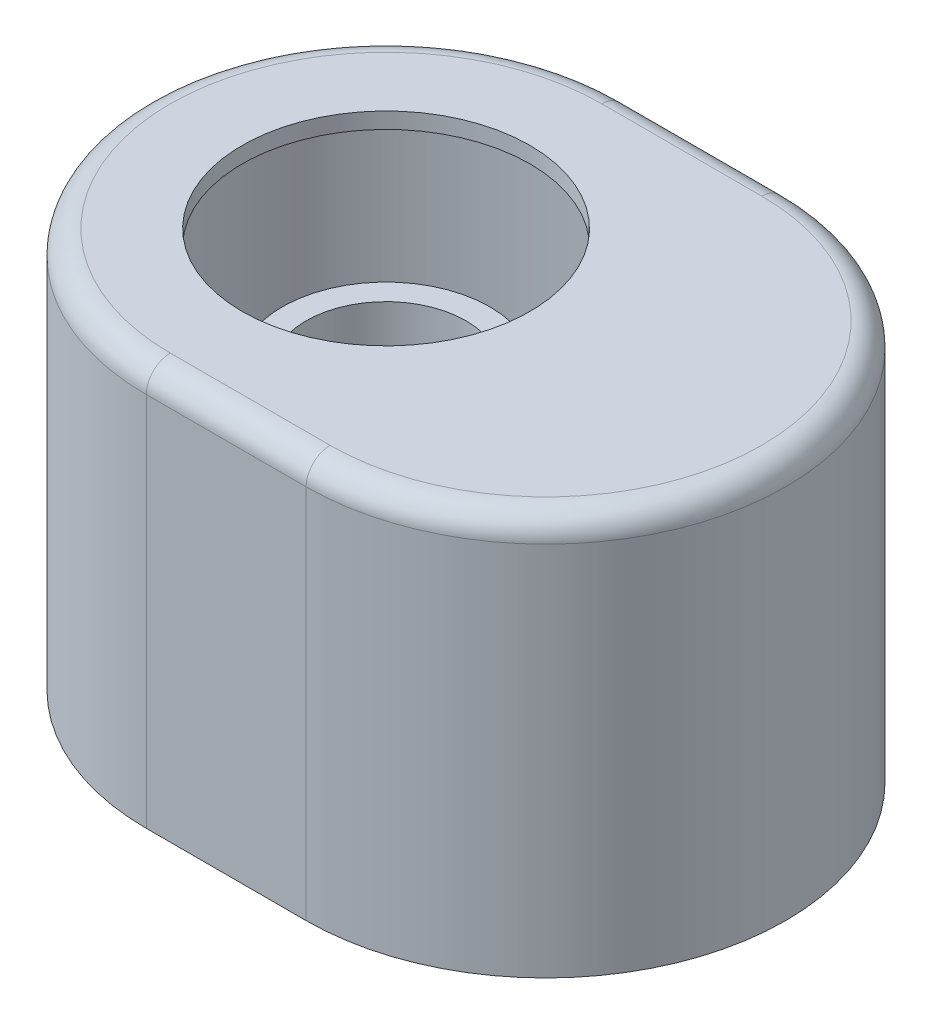
ISO-10303-21;
HEADER;
FILE_DESCRIPTION(('STEP AP214'),'2;1');
FILE_NAME('part.step','',(''),(''),'','','');
FILE_SCHEMA(('AUTOMOTIVE_DESIGN { 1 0 10303 214 1 1 1 1 }'));
ENDSEC;
DATA;
#1=APPLICATION_CONTEXT('core data for automotive mechanical design processes');
#2=APPLICATION_PROTOCOL_DEFINITION('international standard','automotive_design',2000,#1);
#3=PRODUCT_CONTEXT('',#1,'mechanical');
#4=PRODUCT('Part','Part','',(#3));
#5=PRODUCT_RELATED_PRODUCT_CATEGORY('part','',(#4));
#6=PRODUCT_DEFINITION_FORMATION('','',#4);
#7=PRODUCT_DEFINITION_CONTEXT('part definition',#1,'design');
#8=PRODUCT_DEFINITION('design','',#6,#7);
#9=PRODUCT_DEFINITION_SHAPE('','',#8);
#10=(LENGTH_UNIT() NAMED_UNIT(*) SI_UNIT(.MILLI.,.METRE.));
#11=(NAMED_UNIT(*) PLANE_ANGLE_UNIT() SI_UNIT($,.RADIAN.));
#12=(NAMED_UNIT(*) SI_UNIT($,.STERADIAN.) SOLID_ANGLE_UNIT());
#13=UNCERTAINTY_MEASURE_WITH_UNIT(LENGTH_MEASURE(1.E-05),#10,'distance_accuracy_value','');
#14=(GEOMETRIC_REPRESENTATION_CONTEXT(3) GLOBAL_UNCERTAINTY_ASSIGNED_CONTEXT((#13)) GLOBAL_UNIT_ASSIGNED_CONTEXT((#10,
#11,#12)) REPRESENTATION_CONTEXT('',''));
#15=CARTESIAN_POINT('',(0.,0.,0.));
#16=DIRECTION('',(0.,0.,1.));
#17=DIRECTION('',(1.,0.,0.));
#18=AXIS2_PLACEMENT_3D('',#15,#16,#17);
#19=CARTESIAN_POINT('',(0.,0.,0.));
#20=DIRECTION('',(0.,-1.,0.));
#21=DIRECTION('',(0.,0.,-1.));
#22=AXIS2_PLACEMENT_3D('',#19,#20,#21);
#23=CYLINDRICAL_SURFACE('',#22,10.);
#24=CARTESIAN_POINT('',(0.,35.,0.));
#25=DIRECTION('',(0.,-1.,0.));
#26=DIRECTION('',(0.,0.,-1.));
#27=AXIS2_PLACEMENT_3D('',#24,#25,#26);
#28=CIRCLE('',#27,10.);
#29=CARTESIAN_POINT('',(0.,35.,-10.));
#30=VERTEX_POINT('',#29);
#31=EDGE_CURVE('E11',#30,#30,#28,.T.);
#32=ORIENTED_EDGE('',*,*,#31,.F.);
#33=EDGE_LOOP('',(#32));
#34=FACE_BOUND('',#33,.T.);
#35=CARTESIAN_POINT('',(0.,29.,0.));
#36=DIRECTION('',(0.,-1.,0.));
#37=DIRECTION('',(0.,0.,-1.));
#38=AXIS2_PLACEMENT_3D('',#35,#36,#37);
#39=CIRCLE('',#38,10.);
#40=CARTESIAN_POINT('',(0.,29.,-10.));
#41=VERTEX_POINT('',#40);
#42=EDGE_CURVE('E86',#41,#41,#39,.T.);
#43=ORIENTED_EDGE('',*,*,#42,.T.);
#44=EDGE_LOOP('',(#43));
#45=FACE_BOUND('',#44,.T.);
#46=ADVANCED_FACE('F46',(#34,#45),#23,.F.);
#47=CARTESIAN_POINT('',(-10.,35.,0.));
#48=DIRECTION('',(0.,-1.,0.));
#49=DIRECTION('',(0.,0.,-1.));
#50=AXIS2_PLACEMENT_3D('',#47,#48,#49);
#51=PLANE('',#50);
#52=CARTESIAN_POINT('',(0.,35.,0.));
#53=DIRECTION('',(0.,-1.,0.));
#54=DIRECTION('',(0.,0.,-1.));
#55=AXIS2_PLACEMENT_3D('',#52,#53,#54);
#56=CIRCLE('',#55,13.);
#57=CARTESIAN_POINT('',(0.,35.,-13.));
#58=VERTEX_POINT('',#57);
#59=EDGE_CURVE('E52',#58,#58,#56,.T.);
#60=ORIENTED_EDGE('',*,*,#59,.F.);
#61=EDGE_LOOP('',(#60));
#62=FACE_BOUND('',#61,.T.);
#63=ORIENTED_EDGE('',*,*,#31,.T.);
#64=EDGE_LOOP('',(#63));
#65=FACE_BOUND('',#64,.T.);
#66=ADVANCED_FACE('F147',(#62,#65),#51,.F.);
#67=CARTESIAN_POINT('',(0.,0.,0.));
#68=DIRECTION('',(0.,-1.,0.));
#69=DIRECTION('',(0.,0.,-1.));
#70=AXIS2_PLACEMENT_3D('',#67,#68,#69);
#71=CYLINDRICAL_SURFACE('',#70,13.);
#72=CARTESIAN_POINT('',(0.,27.6328891488858,0.));
#73=DIRECTION('',(0.,-1.,0.));
#74=DIRECTION('',(0.,0.,-1.));
#75=AXIS2_PLACEMENT_3D('',#72,#73,#74);
#76=CIRCLE('',#75,13.);
#77=CARTESIAN_POINT('',(0.,27.6328891488858,-13.));
#78=VERTEX_POINT('',#77);
#79=EDGE_CURVE('E56',#78,#78,#76,.T.);
#80=ORIENTED_EDGE('',*,*,#79,.F.);
#81=EDGE_LOOP('',(#80));
#82=FACE_BOUND('',#81,.T.);
#83=ORIENTED_EDGE('',*,*,#59,.T.);
#84=EDGE_LOOP('',(#83));
#85=FACE_BOUND('',#84,.T.);
#86=ADVANCED_FACE('F142',(#82,#85),#71,.T.);
#87=CARTESIAN_POINT('',(0.,27.6328891488858,0.));
#88=DIRECTION('',(0.,1.,0.));
#89=DIRECTION('',(0.,0.,1.));
#90=AXIS2_PLACEMENT_3D('',#87,#88,#89);
#91=CONICAL_SURFACE('',#90,13.,0.528074448426359);
#92=CARTESIAN_POINT('',(0.,21.6328891488858,0.));
#93=DIRECTION('',(0.,-1.,0.));
#94=DIRECTION('',(0.,0.,-1.));
#95=AXIS2_PLACEMENT_3D('',#92,#93,#94);
#96=CIRCLE('',#95,9.5);
#97=CARTESIAN_POINT('',(0.,21.6328891488858,-9.5));
#98=VERTEX_POINT('',#97);
#99=EDGE_CURVE('E60',#98,#98,#96,.T.);
#100=ORIENTED_EDGE('',*,*,#99,.F.);
#101=EDGE_LOOP('',(#100));
#102=FACE_BOUND('',#101,.T.);
#103=ORIENTED_EDGE('',*,*,#79,.T.);
#104=EDGE_LOOP('',(#103));
#105=FACE_BOUND('',#104,.T.);
#106=ADVANCED_FACE('F136',(#102,#105),#91,.T.);
#107=CARTESIAN_POINT('',(0.,0.,0.));
#108=DIRECTION('',(0.,-1.,0.));
#109=DIRECTION('',(0.,0.,-1.));
#110=AXIS2_PLACEMENT_3D('',#107,#108,#109);
#111=CYLINDRICAL_SURFACE('',#110,9.5);
#112=CARTESIAN_POINT('',(0.,15.,0.));
#113=DIRECTION('',(0.,-1.,0.));
#114=DIRECTION('',(0.,0.,-1.));
#115=AXIS2_PLACEMENT_3D('',#112,#113,#114);
#116=CIRCLE('',#115,9.5);
#117=CARTESIAN_POINT('',(0.,15.,-9.5));
#118=VERTEX_POINT('',#117);
#119=EDGE_CURVE('E65',#118,#118,#116,.T.);
#120=ORIENTED_EDGE('',*,*,#119,.F.);
#121=EDGE_LOOP('',(#120));
#122=FACE_BOUND('',#121,.T.);
#123=ORIENTED_EDGE('',*,*,#99,.T.);
#124=EDGE_LOOP('',(#123));
#125=FACE_BOUND('',#124,.T.);
#126=ADVANCED_FACE('F130',(#122,#125),#111,.T.);
#127=CARTESIAN_POINT('',(-9.5,15.,0.));
#128=DIRECTION('',(0.,1.,0.));
#129=DIRECTION('',(0.,0.,1.));
#130=AXIS2_PLACEMENT_3D('',#127,#128,#129);
#131=PLANE('',#130);
#132=CARTESIAN_POINT('',(0.,15.,0.));
#133=DIRECTION('',(0.,-1.,0.));
#134=DIRECTION('',(0.,0.,-1.));
#135=AXIS2_PLACEMENT_3D('',#132,#133,#134);
#136=CIRCLE('',#135,6.5);
#137=CARTESIAN_POINT('',(0.,15.,-6.5));
#138=VERTEX_POINT('',#137);
#139=EDGE_CURVE('E68',#138,#138,#136,.T.);
#140=ORIENTED_EDGE('',*,*,#139,.F.);
#141=EDGE_LOOP('',(#140));
#142=FACE_BOUND('',#141,.T.);
#143=ORIENTED_EDGE('',*,*,#119,.T.);
#144=EDGE_LOOP('',(#143));
#145=FACE_BOUND('',#144,.T.);
#146=ADVANCED_FACE('F124',(#142,#145),#131,.F.);
#147=CARTESIAN_POINT('',(0.,0.,0.));
#148=DIRECTION('',(0.,-1.,0.));
#149=DIRECTION('',(0.,0.,-1.));
#150=AXIS2_PLACEMENT_3D('',#147,#148,#149);
#151=CYLINDRICAL_SURFACE('',#150,6.5);
#152=CARTESIAN_POINT('',(0.,19.,0.));
#153=DIRECTION('',(0.,-1.,0.));
#154=DIRECTION('',(0.,0.,-1.));
#155=AXIS2_PLACEMENT_3D('',#152,#153,#154);
#156=CIRCLE('',#155,6.5);
#157=CARTESIAN_POINT('',(0.,19.,-6.5));
#158=VERTEX_POINT('',#157);
#159=EDGE_CURVE('E71',#158,#158,#156,.T.);
#160=ORIENTED_EDGE('',*,*,#159,.F.);
#161=EDGE_LOOP('',(#160));
#162=FACE_BOUND('',#161,.T.);
#163=ORIENTED_EDGE('',*,*,#139,.T.);
#164=EDGE_LOOP('',(#163));
#165=FACE_BOUND('',#164,.T.);
#166=ADVANCED_FACE('F118',(#162,#165),#151,.F.);
#167=CARTESIAN_POINT('',(-6.5,19.,0.));
#168=DIRECTION('',(0.,1.,0.));
#169=DIRECTION('',(0.,0.,1.));
#170=AXIS2_PLACEMENT_3D('',#167,#168,#169);
#171=PLANE('',#170);
#172=CARTESIAN_POINT('',(0.,19.,0.));
#173=DIRECTION('',(0.,-1.,0.));
#174=DIRECTION('',(0.,0.,-1.));
#175=AXIS2_PLACEMENT_3D('',#172,#173,#174);
#176=CIRCLE('',#175,4.5);
#177=CARTESIAN_POINT('',(0.,19.,-4.5));
#178=VERTEX_POINT('',#177);
#179=EDGE_CURVE('E74',#178,#178,#176,.T.);
#180=ORIENTED_EDGE('',*,*,#179,.F.);
#181=EDGE_LOOP('',(#180));
#182=FACE_BOUND('',#181,.T.);
#183=ORIENTED_EDGE('',*,*,#159,.T.);
#184=EDGE_LOOP('',(#183));
#185=FACE_BOUND('',#184,.T.);
#186=ADVANCED_FACE('F112',(#182,#185),#171,.F.);
#187=CARTESIAN_POINT('',(0.,0.,0.));
#188=DIRECTION('',(0.,-1.,0.));
#189=DIRECTION('',(0.,0.,-1.));
#190=AXIS2_PLACEMENT_3D('',#187,#188,#189);
#191=CYLINDRICAL_SURFACE('',#190,4.5);
#192=CARTESIAN_POINT('',(0.,21.,0.));
#193=DIRECTION('',(0.,-1.,0.));
#194=DIRECTION('',(0.,0.,-1.));
#195=AXIS2_PLACEMENT_3D('',#192,#193,#194);
#196=CIRCLE('',#195,4.5);
#197=CARTESIAN_POINT('',(0.,21.,-4.5));
#198=VERTEX_POINT('',#197);
#199=EDGE_CURVE('E77',#198,#198,#196,.T.);
#200=ORIENTED_EDGE('',*,*,#199,.F.);
#201=EDGE_LOOP('',(#200));
#202=FACE_BOUND('',#201,.T.);
#203=ORIENTED_EDGE('',*,*,#179,.T.);
#204=EDGE_LOOP('',(#203));
#205=FACE_BOUND('',#204,.T.);
#206=ADVANCED_FACE('F106',(#202,#205),#191,.F.);
#207=CARTESIAN_POINT('',(0.,21.,0.));
#208=DIRECTION('',(0.,1.,0.));
#209=DIRECTION('',(0.,0.,1.));
#210=AXIS2_PLACEMENT_3D('',#207,#208,#209);
#211=CONICAL_SURFACE('',#210,4.5,0.528074448426359);
#212=CARTESIAN_POINT('',(0.,27.,0.));
#213=DIRECTION('',(0.,-1.,0.));
#214=DIRECTION('',(0.,0.,-1.));
#215=AXIS2_PLACEMENT_3D('',#212,#213,#214);
#216=CIRCLE('',#215,8.);
#217=CARTESIAN_POINT('',(0.,27.,-8.));
#218=VERTEX_POINT('',#217);
#219=EDGE_CURVE('E80',#218,#218,#216,.T.);
#220=ORIENTED_EDGE('',*,*,#219,.F.);
#221=EDGE_LOOP('',(#220));
#222=FACE_BOUND('',#221,.T.);
#223=ORIENTED_EDGE('',*,*,#199,.T.);
#224=EDGE_LOOP('',(#223));
#225=FACE_BOUND('',#224,.T.);
#226=ADVANCED_FACE('F100',(#222,#225),#211,.F.);
#227=CARTESIAN_POINT('',(0.,0.,0.));
#228=DIRECTION('',(0.,-1.,0.));
#229=DIRECTION('',(0.,0.,-1.));
#230=AXIS2_PLACEMENT_3D('',#227,#228,#229);
#231=CYLINDRICAL_SURFACE('',#230,8.);
#232=CARTESIAN_POINT('',(0.,29.,0.));
#233=DIRECTION('',(0.,-1.,0.));
#234=DIRECTION('',(0.,0.,-1.));
#235=AXIS2_PLACEMENT_3D('',#232,#233,#234);
#236=CIRCLE('',#235,8.);
#237=CARTESIAN_POINT('',(0.,29.,-8.));
#238=VERTEX_POINT('',#237);
#239=EDGE_CURVE('E83',#238,#238,#236,.T.);
#240=ORIENTED_EDGE('',*,*,#239,.F.);
#241=EDGE_LOOP('',(#240));
#242=FACE_BOUND('',#241,.T.);
#243=ORIENTED_EDGE('',*,*,#219,.T.);
#244=EDGE_LOOP('',(#243));
#245=FACE_BOUND('',#244,.T.);
#246=ADVANCED_FACE('F94',(#242,#245),#231,.F.);
#247=CARTESIAN_POINT('',(-8.,29.,0.));
#248=DIRECTION('',(0.,-1.,0.));
#249=DIRECTION('',(0.,0.,-1.));
#250=AXIS2_PLACEMENT_3D('',#247,#248,#249);
#251=PLANE('',#250);
#252=ORIENTED_EDGE('',*,*,#42,.F.);
#253=EDGE_LOOP('',(#252));
#254=FACE_BOUND('',#253,.T.);
#255=ORIENTED_EDGE('',*,*,#239,.T.);
#256=EDGE_LOOP('',(#255));
#257=FACE_BOUND('',#256,.T.);
#258=ADVANCED_FACE('F91',(#254,#257),#251,.F.);
#259=CLOSED_SHELL('',(#46,#66,#86,#106,#126,#146,#166,#186,#206,#226,#246,#258));
#260=MANIFOLD_SOLID_BREP('B2',#259);
#261=CARTESIAN_POINT('',(0.,50.,0.));
#262=DIRECTION('',(0.,-1.,0.));
#263=DIRECTION('',(0.,0.,-1.));
#264=AXIS2_PLACEMENT_3D('',#261,#262,#263);
#265=CYLINDRICAL_SURFACE('',#264,30.);
#266=DIRECTION('',(0.,-1.,0.));
#267=VECTOR('',#266,1.);
#268=CARTESIAN_POINT('',(0.,50.,30.));
#269=LINE('',#268,#267);
#270=CARTESIAN_POINT('',(0.,47.,30.));
#271=VERTEX_POINT('',#270);
#272=CARTESIAN_POINT('',(0.,0.,30.));
#273=VERTEX_POINT('',#272);
#274=EDGE_CURVE('E413',#271,#273,#269,.T.);
#275=ORIENTED_EDGE('',*,*,#274,.F.);
#276=CARTESIAN_POINT('',(0.,47.,0.));
#277=DIRECTION('',(0.,1.,0.));
#278=DIRECTION('',(0.,0.,1.));
#279=AXIS2_PLACEMENT_3D('',#276,#277,#278);
#280=CIRCLE('',#279,30.);
#281=CARTESIAN_POINT('',(0.,47.,-30.));
#282=VERTEX_POINT('',#281);
#283=EDGE_CURVE('E44',#271,#282,#280,.F.);
#284=ORIENTED_EDGE('',*,*,#283,.T.);
#285=DIRECTION('',(0.,-1.,0.));
#286=VECTOR('',#285,1.);
#287=CARTESIAN_POINT('',(0.,50.,-30.));
#288=LINE('',#287,#286);
#289=CARTESIAN_POINT('',(0.,0.,-30.));
#290=VERTEX_POINT('',#289);
#291=EDGE_CURVE('E407',#282,#290,#288,.T.);
#292=ORIENTED_EDGE('',*,*,#291,.T.);
#293=CARTESIAN_POINT('',(0.,0.,0.));
#294=DIRECTION('',(0.,1.,0.));
#295=DIRECTION('',(0.,0.,1.));
#296=AXIS2_PLACEMENT_3D('',#293,#294,#295);
#297=CIRCLE('',#296,30.);
#298=EDGE_CURVE('E395',#290,#273,#297,.T.);
#299=ORIENTED_EDGE('',*,*,#298,.T.);
#300=EDGE_LOOP('',(#275,#284,#292,#299));
#301=FACE_BOUND('',#300,.T.);
#302=ADVANCED_FACE('F251',(#301),#265,.T.);
#303=CARTESIAN_POINT('',(0.,50.,30.));
#304=DIRECTION('',(0.,0.,-1.));
#305=DIRECTION('',(-1.,0.,0.));
#306=AXIS2_PLACEMENT_3D('',#303,#304,#305);
#307=PLANE('',#306);
#308=DIRECTION('',(0.,-1.,0.));
#309=VECTOR('',#308,1.);
#310=CARTESIAN_POINT('',(20.,50.,30.));
#311=LINE('',#310,#309);
#312=CARTESIAN_POINT('',(20.,47.,30.));
#313=VERTEX_POINT('',#312);
#314=CARTESIAN_POINT('',(20.,0.,30.));
#315=VERTEX_POINT('',#314);
#316=EDGE_CURVE('E411',#313,#315,#311,.T.);
#317=ORIENTED_EDGE('',*,*,#316,.F.);
#318=DIRECTION('',(1.,0.,0.));
#319=VECTOR('',#318,1.);
#320=CARTESIAN_POINT('',(0.,47.,30.));
#321=LINE('',#320,#319);
#322=EDGE_CURVE('E260',#313,#271,#321,.F.);
#323=ORIENTED_EDGE('',*,*,#322,.T.);
#324=ORIENTED_EDGE('',*,*,#274,.T.);
#325=DIRECTION('',(1.,0.,0.));
#326=VECTOR('',#325,1.);
#327=CARTESIAN_POINT('',(0.,0.,30.));
#328=LINE('',#327,#326);
#329=EDGE_CURVE('E398',#273,#315,#328,.T.);
#330=ORIENTED_EDGE('',*,*,#329,.T.);
#331=EDGE_LOOP('',(#317,#323,#324,#330));
#332=FACE_BOUND('',#331,.T.);
#333=ADVANCED_FACE('F477',(#332),#307,.F.);
#334=CARTESIAN_POINT('',(20.,50.,0.));
#335=DIRECTION('',(0.,-1.,0.));
#336=DIRECTION('',(0.,0.,-1.));
#337=AXIS2_PLACEMENT_3D('',#334,#335,#336);
#338=CYLINDRICAL_SURFACE('',#337,30.);
#339=DIRECTION('',(0.,-1.,0.));
#340=VECTOR('',#339,1.);
#341=CARTESIAN_POINT('',(20.,50.,-30.));
#342=LINE('',#341,#340);
#343=CARTESIAN_POINT('',(20.,47.,-30.));
#344=VERTEX_POINT('',#343);
#345=CARTESIAN_POINT('',(20.,0.,-30.));
#346=VERTEX_POINT('',#345);
#347=EDGE_CURVE('E409',#344,#346,#342,.T.);
#348=ORIENTED_EDGE('',*,*,#347,.F.);
#349=CARTESIAN_POINT('',(20.,47.,0.));
#350=DIRECTION('',(0.,1.,0.));
#351=DIRECTION('',(0.,0.,1.));
#352=AXIS2_PLACEMENT_3D('',#349,#350,#351);
#353=CIRCLE('',#352,30.);
#354=EDGE_CURVE('E427',#344,#313,#353,.F.);
#355=ORIENTED_EDGE('',*,*,#354,.T.);
#356=ORIENTED_EDGE('',*,*,#316,.T.);
#357=CARTESIAN_POINT('',(20.,0.,0.));
#358=DIRECTION('',(0.,1.,0.));
#359=DIRECTION('',(0.,0.,1.));
#360=AXIS2_PLACEMENT_3D('',#357,#358,#359);
#361=CIRCLE('',#360,30.);
#362=EDGE_CURVE('E401',#315,#346,#361,.T.);
#363=ORIENTED_EDGE('',*,*,#362,.T.);
#364=EDGE_LOOP('',(#348,#355,#356,#363));
#365=FACE_BOUND('',#364,.T.);
#366=ADVANCED_FACE('F472',(#365),#338,.T.);
#367=CARTESIAN_POINT('',(0.,50.,-30.));
#368=DIRECTION('',(0.,0.,1.));
#369=DIRECTION('',(1.,0.,0.));
#370=AXIS2_PLACEMENT_3D('',#367,#368,#369);
#371=PLANE('',#370);
#372=ORIENTED_EDGE('',*,*,#291,.F.);
#373=DIRECTION('',(-1.,0.,0.));
#374=VECTOR('',#373,1.);
#375=CARTESIAN_POINT('',(20.,47.,-30.));
#376=LINE('',#375,#374);
#377=EDGE_CURVE('E424',#282,#344,#376,.F.);
#378=ORIENTED_EDGE('',*,*,#377,.T.);
#379=ORIENTED_EDGE('',*,*,#347,.T.);
#380=DIRECTION('',(-1.,0.,0.));
#381=VECTOR('',#380,1.);
#382=CARTESIAN_POINT('',(0.,0.,-30.));
#383=LINE('',#382,#381);
#384=EDGE_CURVE('E404',#346,#290,#383,.T.);
#385=ORIENTED_EDGE('',*,*,#384,.T.);
#386=EDGE_LOOP('',(#372,#378,#379,#385));
#387=FACE_BOUND('',#386,.T.);
#388=ADVANCED_FACE('F453',(#387),#371,.F.);
#389=CARTESIAN_POINT('',(0.,50.,0.));
#390=DIRECTION('',(0.,1.,0.));
#391=DIRECTION('',(0.,0.,1.));
#392=AXIS2_PLACEMENT_3D('',#389,#390,#391);
#393=PLANE('',#392);
#394=CARTESIAN_POINT('',(0.,50.,0.));
#395=DIRECTION('',(0.,1.,0.));
#396=DIRECTION('',(0.,0.,1.));
#397=AXIS2_PLACEMENT_3D('',#394,#395,#396);
#398=CIRCLE('',#397,18.);
#399=CARTESIAN_POINT('',(0.,50.,18.));
#400=VERTEX_POINT('',#399);
#401=EDGE_CURVE('E383',#400,#400,#398,.T.);
#402=ORIENTED_EDGE('',*,*,#401,.F.);
#403=EDGE_LOOP('',(#402));
#404=FACE_BOUND('',#403,.T.);
#405=CARTESIAN_POINT('',(20.,50.,0.));
#406=DIRECTION('',(0.,1.,0.));
#407=DIRECTION('',(0.,0.,1.));
#408=AXIS2_PLACEMENT_3D('',#405,#406,#407);
#409=CIRCLE('',#408,27.);
#410=CARTESIAN_POINT('',(20.,50.,27.));
#411=VERTEX_POINT('',#410);
#412=CARTESIAN_POINT('',(20.,50.,-27.));
#413=VERTEX_POINT('',#412);
#414=EDGE_CURVE('E419',#411,#413,#409,.T.);
#415=ORIENTED_EDGE('',*,*,#414,.T.);
#416=DIRECTION('',(-1.,0.,0.));
#417=VECTOR('',#416,1.);
#418=CARTESIAN_POINT('',(0.,50.,-27.));
#419=LINE('',#418,#417);
#420=CARTESIAN_POINT('',(0.,50.,-27.));
#421=VERTEX_POINT('',#420);
#422=EDGE_CURVE('E421',#413,#421,#419,.T.);
#423=ORIENTED_EDGE('',*,*,#422,.T.);
#424=CARTESIAN_POINT('',(0.,50.,0.));
#425=DIRECTION('',(0.,1.,0.));
#426=DIRECTION('',(0.,0.,1.));
#427=AXIS2_PLACEMENT_3D('',#424,#425,#426);
#428=CIRCLE('',#427,27.);
#429=CARTESIAN_POINT('',(0.,50.,27.));
#430=VERTEX_POINT('',#429);
#431=EDGE_CURVE('E415',#421,#430,#428,.T.);
#432=ORIENTED_EDGE('',*,*,#431,.T.);
#433=DIRECTION('',(1.,0.,0.));
#434=VECTOR('',#433,1.);
#435=CARTESIAN_POINT('',(20.,50.,27.));
#436=LINE('',#435,#434);
#437=EDGE_CURVE('E417',#430,#411,#436,.T.);
#438=ORIENTED_EDGE('',*,*,#437,.T.);
#439=EDGE_LOOP('',(#415,#423,#432,#438));
#440=FACE_BOUND('',#439,.T.);
#441=ADVANCED_FACE('F461',(#404,#440),#393,.T.);
#442=CARTESIAN_POINT('',(0.,0.,0.));
#443=DIRECTION('',(0.,1.,0.));
#444=DIRECTION('',(0.,0.,1.));
#445=AXIS2_PLACEMENT_3D('',#442,#443,#444);
#446=PLANE('',#445);
#447=DIRECTION('',(-1.,0.,0.));
#448=VECTOR('',#447,1.);
#449=CARTESIAN_POINT('',(0.,0.,-28.));
#450=LINE('',#449,#448);
#451=CARTESIAN_POINT('',(20.,0.,-28.));
#452=VERTEX_POINT('',#451);
#453=CARTESIAN_POINT('',(0.,0.,-28.));
#454=VERTEX_POINT('',#453);
#455=EDGE_CURVE('E364',#452,#454,#450,.T.);
#456=ORIENTED_EDGE('',*,*,#455,.T.);
#457=CARTESIAN_POINT('',(0.,0.,0.));
#458=DIRECTION('',(0.,1.,0.));
#459=DIRECTION('',(0.,0.,1.));
#460=AXIS2_PLACEMENT_3D('',#457,#458,#459);
#461=CIRCLE('',#460,28.);
#462=CARTESIAN_POINT('',(0.,0.,28.));
#463=VERTEX_POINT('',#462);
#464=EDGE_CURVE('E359',#454,#463,#461,.T.);
#465=ORIENTED_EDGE('',*,*,#464,.T.);
#466=DIRECTION('',(1.,0.,0.));
#467=VECTOR('',#466,1.);
#468=CARTESIAN_POINT('',(0.,0.,28.));
#469=LINE('',#468,#467);
#470=CARTESIAN_POINT('',(20.,0.,28.));
#471=VERTEX_POINT('',#470);
#472=EDGE_CURVE('E389',#463,#471,#469,.T.);
#473=ORIENTED_EDGE('',*,*,#472,.T.);
#474=CARTESIAN_POINT('',(20.,0.,0.));
#475=DIRECTION('',(0.,1.,0.));
#476=DIRECTION('',(0.,0.,1.));
#477=AXIS2_PLACEMENT_3D('',#474,#475,#476);
#478=CIRCLE('',#477,28.);
#479=EDGE_CURVE('E268',#471,#452,#478,.T.);
#480=ORIENTED_EDGE('',*,*,#479,.T.);
#481=EDGE_LOOP('',(#456,#465,#473,#480));
#482=FACE_BOUND('',#481,.T.);
#483=ORIENTED_EDGE('',*,*,#298,.F.);
#484=ORIENTED_EDGE('',*,*,#384,.F.);
#485=ORIENTED_EDGE('',*,*,#362,.F.);
#486=ORIENTED_EDGE('',*,*,#329,.F.);
#487=EDGE_LOOP('',(#483,#484,#485,#486));
#488=FACE_BOUND('',#487,.T.);
#489=ADVANCED_FACE('F463',(#482,#488),#446,.F.);
#490=CARTESIAN_POINT('',(0.,47.,27.));
#491=DIRECTION('',(-1.,0.,0.));
#492=DIRECTION('',(0.,0.,1.));
#493=AXIS2_PLACEMENT_3D('',#490,#491,#492);
#494=CYLINDRICAL_SURFACE('',#493,3.);
#495=CARTESIAN_POINT('',(0.,47.,27.));
#496=DIRECTION('',(-1.,0.,0.));
#497=DIRECTION('',(0.,0.,1.));
#498=AXIS2_PLACEMENT_3D('',#495,#496,#497);
#499=CIRCLE('',#498,3.);
#500=EDGE_CURVE('E432',#271,#430,#499,.T.);
#501=ORIENTED_EDGE('',*,*,#500,.F.);
#502=ORIENTED_EDGE('',*,*,#322,.F.);
#503=CARTESIAN_POINT('',(20.,47.,27.));
#504=DIRECTION('',(1.,0.,0.));
#505=DIRECTION('',(0.,0.,-1.));
#506=AXIS2_PLACEMENT_3D('',#503,#504,#505);
#507=CIRCLE('',#506,3.);
#508=EDGE_CURVE('E255',#411,#313,#507,.T.);
#509=ORIENTED_EDGE('',*,*,#508,.F.);
#510=ORIENTED_EDGE('',*,*,#437,.F.);
#511=EDGE_LOOP('',(#501,#502,#509,#510));
#512=FACE_BOUND('',#511,.T.);
#513=ADVANCED_FACE('F253',(#512),#494,.T.);
#514=CARTESIAN_POINT('',(20.,47.,0.));
#515=DIRECTION('',(0.,1.,0.));
#516=DIRECTION('',(0.,0.,1.));
#517=AXIS2_PLACEMENT_3D('',#514,#515,#516);
#518=TOROIDAL_SURFACE('',#517,27.,3.);
#519=ORIENTED_EDGE('',*,*,#508,.T.);
#520=ORIENTED_EDGE('',*,*,#354,.F.);
#521=CARTESIAN_POINT('',(20.,47.,-27.));
#522=DIRECTION('',(-1.,0.,0.));
#523=DIRECTION('',(0.,0.,1.));
#524=AXIS2_PLACEMENT_3D('',#521,#522,#523);
#525=CIRCLE('',#524,3.);
#526=EDGE_CURVE('E431',#413,#344,#525,.T.);
#527=ORIENTED_EDGE('',*,*,#526,.F.);
#528=ORIENTED_EDGE('',*,*,#414,.F.);
#529=EDGE_LOOP('',(#519,#520,#527,#528));
#530=FACE_BOUND('',#529,.T.);
#531=ADVANCED_FACE('F443',(#530),#518,.T.);
#532=CARTESIAN_POINT('',(0.,47.,0.));
#533=DIRECTION('',(0.,1.,0.));
#534=DIRECTION('',(0.,0.,1.));
#535=AXIS2_PLACEMENT_3D('',#532,#533,#534);
#536=TOROIDAL_SURFACE('',#535,27.,3.);
#537=ORIENTED_EDGE('',*,*,#500,.T.);
#538=ORIENTED_EDGE('',*,*,#431,.F.);
#539=CARTESIAN_POINT('',(0.,47.,-27.));
#540=DIRECTION('',(1.,0.,0.));
#541=DIRECTION('',(0.,0.,-1.));
#542=AXIS2_PLACEMENT_3D('',#539,#540,#541);
#543=CIRCLE('',#542,3.);
#544=EDGE_CURVE('E351',#282,#421,#543,.T.);
#545=ORIENTED_EDGE('',*,*,#544,.F.);
#546=ORIENTED_EDGE('',*,*,#283,.F.);
#547=EDGE_LOOP('',(#537,#538,#545,#546));
#548=FACE_BOUND('',#547,.T.);
#549=ADVANCED_FACE('F448',(#548),#536,.T.);
#550=CARTESIAN_POINT('',(0.,47.,-27.));
#551=DIRECTION('',(1.,0.,0.));
#552=DIRECTION('',(0.,0.,-1.));
#553=AXIS2_PLACEMENT_3D('',#550,#551,#552);
#554=CYLINDRICAL_SURFACE('',#553,3.);
#555=ORIENTED_EDGE('',*,*,#526,.T.);
#556=ORIENTED_EDGE('',*,*,#377,.F.);
#557=ORIENTED_EDGE('',*,*,#544,.T.);
#558=ORIENTED_EDGE('',*,*,#422,.F.);
#559=EDGE_LOOP('',(#555,#556,#557,#558));
#560=FACE_BOUND('',#559,.T.);
#561=ADVANCED_FACE('F458',(#560),#554,.T.);
#562=CARTESIAN_POINT('',(0.,50.,0.));
#563=DIRECTION('',(0.,-1.,0.));
#564=DIRECTION('',(0.,0.,-1.));
#565=AXIS2_PLACEMENT_3D('',#562,#563,#564);
#566=CYLINDRICAL_SURFACE('',#565,28.);
#567=DIRECTION('',(0.,1.,0.));
#568=VECTOR('',#567,1.);
#569=CARTESIAN_POINT('',(0.,50.,28.));
#570=LINE('',#569,#568);
#571=CARTESIAN_POINT('',(0.,47.,28.));
#572=VERTEX_POINT('',#571);
#573=EDGE_CURVE('E695',#572,#463,#570,.F.);
#574=ORIENTED_EDGE('',*,*,#573,.T.);
#575=ORIENTED_EDGE('',*,*,#464,.F.);
#576=DIRECTION('',(0.,-1.,0.));
#577=VECTOR('',#576,1.);
#578=CARTESIAN_POINT('',(0.,50.,-28.));
#579=LINE('',#578,#577);
#580=CARTESIAN_POINT('',(0.,47.,-28.));
#581=VERTEX_POINT('',#580);
#582=EDGE_CURVE('E355',#581,#454,#579,.T.);
#583=ORIENTED_EDGE('',*,*,#582,.F.);
#584=CARTESIAN_POINT('',(0.,47.,0.));
#585=DIRECTION('',(0.,-1.,0.));
#586=DIRECTION('',(0.,0.,-1.));
#587=AXIS2_PLACEMENT_3D('',#584,#585,#586);
#588=CIRCLE('',#587,28.);
#589=EDGE_CURVE('E342',#572,#581,#588,.T.);
#590=ORIENTED_EDGE('',*,*,#589,.F.);
#591=EDGE_LOOP('',(#574,#575,#583,#590));
#592=FACE_BOUND('',#591,.T.);
#593=ADVANCED_FACE('F357',(#592),#566,.F.);
#594=CARTESIAN_POINT('',(0.,50.,28.));
#595=DIRECTION('',(0.,0.,-1.));
#596=DIRECTION('',(-1.,0.,0.));
#597=AXIS2_PLACEMENT_3D('',#594,#595,#596);
#598=PLANE('',#597);
#599=DIRECTION('',(0.,-1.,0.));
#600=VECTOR('',#599,1.);
#601=CARTESIAN_POINT('',(20.,50.,28.));
#602=LINE('',#601,#600);
#603=CARTESIAN_POINT('',(20.,47.,28.));
#604=VERTEX_POINT('',#603);
#605=EDGE_CURVE('E696',#604,#471,#602,.T.);
#606=ORIENTED_EDGE('',*,*,#605,.T.);
#607=ORIENTED_EDGE('',*,*,#472,.F.);
#608=ORIENTED_EDGE('',*,*,#573,.F.);
#609=DIRECTION('',(-1.,0.,0.));
#610=VECTOR('',#609,1.);
#611=CARTESIAN_POINT('',(0.,47.,28.));
#612=LINE('',#611,#610);
#613=EDGE_CURVE('E352',#604,#572,#612,.T.);
#614=ORIENTED_EDGE('',*,*,#613,.F.);
#615=EDGE_LOOP('',(#606,#607,#608,#614));
#616=FACE_BOUND('',#615,.T.);
#617=ADVANCED_FACE('F514',(#616),#598,.T.);
#618=CARTESIAN_POINT('',(20.,50.,0.));
#619=DIRECTION('',(0.,-1.,0.));
#620=DIRECTION('',(0.,0.,-1.));
#621=AXIS2_PLACEMENT_3D('',#618,#619,#620);
#622=CYLINDRICAL_SURFACE('',#621,28.);
#623=DIRECTION('',(0.,1.,0.));
#624=VECTOR('',#623,1.);
#625=CARTESIAN_POINT('',(20.,50.,-28.));
#626=LINE('',#625,#624);
#627=CARTESIAN_POINT('',(20.,47.,-28.));
#628=VERTEX_POINT('',#627);
#629=EDGE_CURVE('E363',#628,#452,#626,.F.);
#630=ORIENTED_EDGE('',*,*,#629,.T.);
#631=ORIENTED_EDGE('',*,*,#479,.F.);
#632=ORIENTED_EDGE('',*,*,#605,.F.);
#633=CARTESIAN_POINT('',(20.,47.,0.));
#634=DIRECTION('',(0.,-1.,0.));
#635=DIRECTION('',(0.,0.,-1.));
#636=AXIS2_PLACEMENT_3D('',#633,#634,#635);
#637=CIRCLE('',#636,28.);
#638=EDGE_CURVE('E372',#628,#604,#637,.T.);
#639=ORIENTED_EDGE('',*,*,#638,.F.);
#640=EDGE_LOOP('',(#630,#631,#632,#639));
#641=FACE_BOUND('',#640,.T.);
#642=ADVANCED_FACE('F524',(#641),#622,.F.);
#643=CARTESIAN_POINT('',(0.,50.,-28.));
#644=DIRECTION('',(0.,0.,1.));
#645=DIRECTION('',(1.,0.,0.));
#646=AXIS2_PLACEMENT_3D('',#643,#644,#645);
#647=PLANE('',#646);
#648=ORIENTED_EDGE('',*,*,#582,.T.);
#649=ORIENTED_EDGE('',*,*,#455,.F.);
#650=ORIENTED_EDGE('',*,*,#629,.F.);
#651=DIRECTION('',(1.,0.,0.));
#652=VECTOR('',#651,1.);
#653=CARTESIAN_POINT('',(0.,47.,-28.));
#654=LINE('',#653,#652);
#655=EDGE_CURVE('E368',#581,#628,#654,.T.);
#656=ORIENTED_EDGE('',*,*,#655,.F.);
#657=EDGE_LOOP('',(#648,#649,#650,#656));
#658=FACE_BOUND('',#657,.T.);
#659=ADVANCED_FACE('F369',(#658),#647,.T.);
#660=CARTESIAN_POINT('',(0.,48.,0.));
#661=DIRECTION('',(0.,1.,0.));
#662=DIRECTION('',(0.,0.,1.));
#663=AXIS2_PLACEMENT_3D('',#660,#661,#662);
#664=PLANE('',#663);
#665=CARTESIAN_POINT('',(0.,48.,0.));
#666=DIRECTION('',(0.,1.,0.));
#667=DIRECTION('',(0.,0.,1.));
#668=AXIS2_PLACEMENT_3D('',#665,#666,#667);
#669=CIRCLE('',#668,18.);
#670=CARTESIAN_POINT('',(0.,48.,18.));
#671=VERTEX_POINT('',#670);
#672=EDGE_CURVE('E379',#671,#671,#669,.F.);
#673=ORIENTED_EDGE('',*,*,#672,.F.);
#674=EDGE_LOOP('',(#673));
#675=FACE_BOUND('',#674,.T.);
#676=CARTESIAN_POINT('',(20.,48.,0.));
#677=DIRECTION('',(0.,1.,0.));
#678=DIRECTION('',(0.,0.,1.));
#679=AXIS2_PLACEMENT_3D('',#676,#677,#678);
#680=CIRCLE('',#679,27.);
#681=CARTESIAN_POINT('',(20.,48.,27.));
#682=VERTEX_POINT('',#681);
#683=CARTESIAN_POINT('',(20.,48.,-27.));
#684=VERTEX_POINT('',#683);
#685=EDGE_CURVE('E687',#682,#684,#680,.T.);
#686=ORIENTED_EDGE('',*,*,#685,.F.);
#687=DIRECTION('',(1.,0.,0.));
#688=VECTOR('',#687,1.);
#689=CARTESIAN_POINT('',(0.,48.,27.));
#690=LINE('',#689,#688);
#691=CARTESIAN_POINT('',(0.,48.,27.));
#692=VERTEX_POINT('',#691);
#693=EDGE_CURVE('E688',#692,#682,#690,.T.);
#694=ORIENTED_EDGE('',*,*,#693,.F.);
#695=CARTESIAN_POINT('',(0.,48.,0.));
#696=DIRECTION('',(0.,1.,0.));
#697=DIRECTION('',(0.,0.,1.));
#698=AXIS2_PLACEMENT_3D('',#695,#696,#697);
#699=CIRCLE('',#698,27.);
#700=CARTESIAN_POINT('',(0.,48.,-27.));
#701=VERTEX_POINT('',#700);
#702=EDGE_CURVE('E692',#701,#692,#699,.T.);
#703=ORIENTED_EDGE('',*,*,#702,.F.);
#704=DIRECTION('',(1.,0.,0.));
#705=VECTOR('',#704,1.);
#706=CARTESIAN_POINT('',(0.,48.,-27.));
#707=LINE('',#706,#705);
#708=EDGE_CURVE('E373',#684,#701,#707,.F.);
#709=ORIENTED_EDGE('',*,*,#708,.F.);
#710=EDGE_LOOP('',(#686,#694,#703,#709));
#711=FACE_BOUND('',#710,.T.);
#712=ADVANCED_FACE('F544',(#675,#711),#664,.F.);
#713=CARTESIAN_POINT('',(0.,47.,27.));
#714=DIRECTION('',(-1.,0.,0.));
#715=DIRECTION('',(0.,0.,1.));
#716=AXIS2_PLACEMENT_3D('',#713,#714,#715);
#717=CYLINDRICAL_SURFACE('',#716,1.);
#718=CARTESIAN_POINT('',(0.,47.,27.));
#719=DIRECTION('',(-1.,0.,0.));
#720=DIRECTION('',(0.,0.,1.));
#721=AXIS2_PLACEMENT_3D('',#718,#719,#720);
#722=CIRCLE('',#721,1.);
#723=EDGE_CURVE('E349',#572,#692,#722,.T.);
#724=ORIENTED_EDGE('',*,*,#723,.T.);
#725=ORIENTED_EDGE('',*,*,#693,.T.);
#726=CARTESIAN_POINT('',(20.,47.,27.));
#727=DIRECTION('',(-1.,0.,0.));
#728=DIRECTION('',(0.,0.,1.));
#729=AXIS2_PLACEMENT_3D('',#726,#727,#728);
#730=CIRCLE('',#729,1.);
#731=EDGE_CURVE('E390',#682,#604,#730,.F.);
#732=ORIENTED_EDGE('',*,*,#731,.T.);
#733=ORIENTED_EDGE('',*,*,#613,.T.);
#734=EDGE_LOOP('',(#724,#725,#732,#733));
#735=FACE_BOUND('',#734,.T.);
#736=ADVANCED_FACE('F552',(#735),#717,.F.);
#737=CARTESIAN_POINT('',(20.,47.,0.));
#738=DIRECTION('',(0.,1.,0.));
#739=DIRECTION('',(0.,0.,1.));
#740=AXIS2_PLACEMENT_3D('',#737,#738,#739);
#741=TOROIDAL_SURFACE('',#740,27.,1.);
#742=ORIENTED_EDGE('',*,*,#731,.F.);
#743=ORIENTED_EDGE('',*,*,#685,.T.);
#744=CARTESIAN_POINT('',(20.,47.,-27.));
#745=DIRECTION('',(1.,0.,0.));
#746=DIRECTION('',(0.,0.,-1.));
#747=AXIS2_PLACEMENT_3D('',#744,#745,#746);
#748=CIRCLE('',#747,1.);
#749=EDGE_CURVE('E378',#684,#628,#748,.F.);
#750=ORIENTED_EDGE('',*,*,#749,.T.);
#751=ORIENTED_EDGE('',*,*,#638,.T.);
#752=EDGE_LOOP('',(#742,#743,#750,#751));
#753=FACE_BOUND('',#752,.T.);
#754=ADVANCED_FACE('F557',(#753),#741,.F.);
#755=CARTESIAN_POINT('',(0.,47.,0.));
#756=DIRECTION('',(0.,1.,0.));
#757=DIRECTION('',(0.,0.,1.));
#758=AXIS2_PLACEMENT_3D('',#755,#756,#757);
#759=TOROIDAL_SURFACE('',#758,27.,1.);
#760=ORIENTED_EDGE('',*,*,#723,.F.);
#761=ORIENTED_EDGE('',*,*,#589,.T.);
#762=CARTESIAN_POINT('',(0.,47.,-27.));
#763=DIRECTION('',(1.,0.,0.));
#764=DIRECTION('',(0.,0.,-1.));
#765=AXIS2_PLACEMENT_3D('',#762,#763,#764);
#766=CIRCLE('',#765,1.);
#767=EDGE_CURVE('E346',#581,#701,#766,.T.);
#768=ORIENTED_EDGE('',*,*,#767,.T.);
#769=ORIENTED_EDGE('',*,*,#702,.T.);
#770=EDGE_LOOP('',(#760,#761,#768,#769));
#771=FACE_BOUND('',#770,.T.);
#772=ADVANCED_FACE('F344',(#771),#759,.F.);
#773=CARTESIAN_POINT('',(0.,47.,-27.));
#774=DIRECTION('',(1.,0.,0.));
#775=DIRECTION('',(0.,0.,-1.));
#776=AXIS2_PLACEMENT_3D('',#773,#774,#775);
#777=CYLINDRICAL_SURFACE('',#776,1.);
#778=ORIENTED_EDGE('',*,*,#749,.F.);
#779=ORIENTED_EDGE('',*,*,#708,.T.);
#780=ORIENTED_EDGE('',*,*,#767,.F.);
#781=ORIENTED_EDGE('',*,*,#655,.T.);
#782=EDGE_LOOP('',(#778,#779,#780,#781));
#783=FACE_BOUND('',#782,.T.);
#784=ADVANCED_FACE('F376',(#783),#777,.F.);
#785=CARTESIAN_POINT('',(0.,-0.001000000000001,0.));
#786=DIRECTION('',(0.,1.,0.));
#787=DIRECTION('',(0.,0.,1.));
#788=AXIS2_PLACEMENT_3D('',#785,#786,#787);
#789=CYLINDRICAL_SURFACE('',#788,18.);
#790=ORIENTED_EDGE('',*,*,#401,.T.);
#791=EDGE_LOOP('',(#790));
#792=FACE_BOUND('',#791,.T.);
#793=ORIENTED_EDGE('',*,*,#672,.T.);
#794=EDGE_LOOP('',(#793));
#795=FACE_BOUND('',#794,.T.);
#796=ADVANCED_FACE('F586',(#792,#795),#789,.F.);
#797=CLOSED_SHELL('',(#302,#333,#366,#388,#441,#489,#513,#531,#549,#561,#593,#617,#642,#659,
#712,#736,#754,#772,#784,#796));
#798=MANIFOLD_SOLID_BREP('B6',#797);
#799=ADVANCED_BREP_SHAPE_REPRESENTATION('',(#18,#260,#798),#14);
#800=SHAPE_DEFINITION_REPRESENTATION(#9,#799);
ENDSEC;
END-ISO-10303-21;
